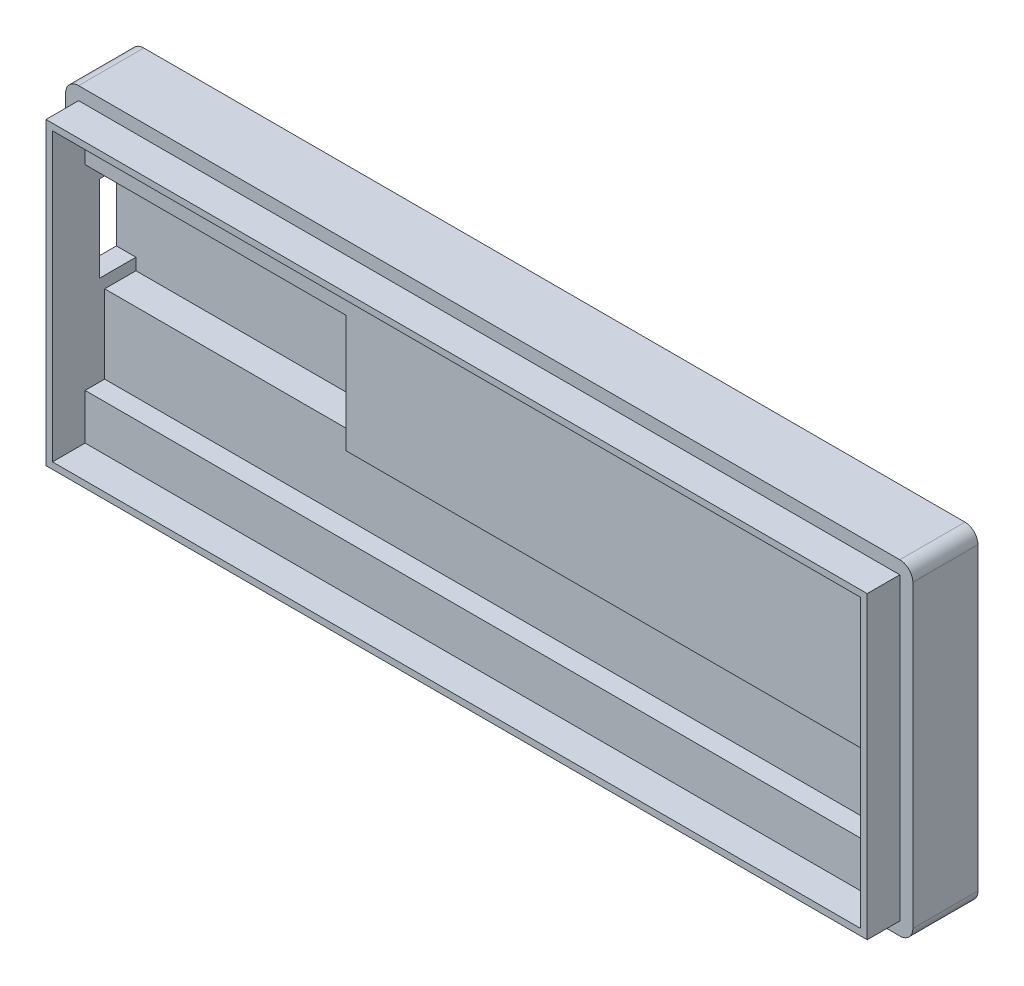
ISO-10303-21;
HEADER;
FILE_DESCRIPTION(('STEP AP214'),'2;1');
FILE_NAME('part.step','',(''),(''),'','','');
FILE_SCHEMA(('AUTOMOTIVE_DESIGN { 1 0 10303 214 1 1 1 1 }'));
ENDSEC;
DATA;
#1=APPLICATION_CONTEXT('core data for automotive mechanical design processes');
#2=APPLICATION_PROTOCOL_DEFINITION('international standard','automotive_design',2000,#1);
#3=PRODUCT_CONTEXT('',#1,'mechanical');
#4=PRODUCT('Part','Part','',(#3));
#5=PRODUCT_RELATED_PRODUCT_CATEGORY('part','',(#4));
#6=PRODUCT_DEFINITION_FORMATION('','',#4);
#7=PRODUCT_DEFINITION_CONTEXT('part definition',#1,'design');
#8=PRODUCT_DEFINITION('design','',#6,#7);
#9=PRODUCT_DEFINITION_SHAPE('','',#8);
#10=(LENGTH_UNIT() NAMED_UNIT(*) SI_UNIT(.MILLI.,.METRE.));
#11=(NAMED_UNIT(*) PLANE_ANGLE_UNIT() SI_UNIT($,.RADIAN.));
#12=(NAMED_UNIT(*) SI_UNIT($,.STERADIAN.) SOLID_ANGLE_UNIT());
#13=UNCERTAINTY_MEASURE_WITH_UNIT(LENGTH_MEASURE(1.E-05),#10,'distance_accuracy_value','');
#14=(GEOMETRIC_REPRESENTATION_CONTEXT(3) GLOBAL_UNCERTAINTY_ASSIGNED_CONTEXT((#13)) GLOBAL_UNIT_ASSIGNED_CONTEXT((#10,
#11,#12)) REPRESENTATION_CONTEXT('',''));
#15=CARTESIAN_POINT('',(0.,0.,0.));
#16=DIRECTION('',(0.,0.,1.));
#17=DIRECTION('',(1.,0.,0.));
#18=AXIS2_PLACEMENT_3D('',#15,#16,#17);
#19=CARTESIAN_POINT('',(0.,0.,0.));
#20=DIRECTION('',(0.,0.,1.));
#21=DIRECTION('',(1.,0.,0.));
#22=AXIS2_PLACEMENT_3D('',#19,#20,#21);
#23=PLANE('',#22);
#24=DIRECTION('',(-1.,0.,0.));
#25=VECTOR('',#24,1.);
#26=CARTESIAN_POINT('',(-62.5,21.9999999999999,0.));
#27=LINE('',#26,#25);
#28=CARTESIAN_POINT('',(61.5,21.9999999999999,0.));
#29=VERTEX_POINT('',#28);
#30=CARTESIAN_POINT('',(-62.5,21.9999999999999,0.));
#31=VERTEX_POINT('',#30);
#32=EDGE_CURVE('E236',#29,#31,#27,.T.);
#33=ORIENTED_EDGE('',*,*,#32,.T.);
#34=DIRECTION('',(0.,-1.,0.));
#35=VECTOR('',#34,1.);
#36=CARTESIAN_POINT('',(-62.5,21.9999999999999,0.));
#37=LINE('',#36,#35);
#38=CARTESIAN_POINT('',(-62.5,14.9999999999999,0.));
#39=VERTEX_POINT('',#38);
#40=EDGE_CURVE('E252',#31,#39,#37,.T.);
#41=ORIENTED_EDGE('',*,*,#40,.T.);
#42=DIRECTION('',(1.,0.,0.));
#43=VECTOR('',#42,1.);
#44=CARTESIAN_POINT('',(0.,14.9999999999999,0.));
#45=LINE('',#44,#43);
#46=CARTESIAN_POINT('',(-22.5,14.9999999999999,0.));
#47=VERTEX_POINT('',#46);
#48=EDGE_CURVE('E372',#39,#47,#45,.T.);
#49=ORIENTED_EDGE('',*,*,#48,.T.);
#50=DIRECTION('',(0.,1.,0.));
#51=VECTOR('',#50,1.);
#52=CARTESIAN_POINT('',(-22.5,0.,0.));
#53=LINE('',#52,#51);
#54=CARTESIAN_POINT('',(-22.5,-3.00000000000007,0.));
#55=VERTEX_POINT('',#54);
#56=EDGE_CURVE('E348',#55,#47,#53,.T.);
#57=ORIENTED_EDGE('',*,*,#56,.F.);
#58=DIRECTION('',(1.,0.,0.));
#59=VECTOR('',#58,1.);
#60=CARTESIAN_POINT('',(0.,-3.00000000000007,0.));
#61=LINE('',#60,#59);
#62=CARTESIAN_POINT('',(59.5,-3.00000000000007,0.));
#63=VERTEX_POINT('',#62);
#64=EDGE_CURVE('E363',#55,#63,#61,.T.);
#65=ORIENTED_EDGE('',*,*,#64,.T.);
#66=DIRECTION('',(0.,-1.,0.));
#67=VECTOR('',#66,1.);
#68=CARTESIAN_POINT('',(59.5,0.,0.));
#69=LINE('',#68,#67);
#70=CARTESIAN_POINT('',(59.5,-15.0000000000001,0.));
#71=VERTEX_POINT('',#70);
#72=EDGE_CURVE('E366',#63,#71,#69,.T.);
#73=ORIENTED_EDGE('',*,*,#72,.T.);
#74=DIRECTION('',(1.,0.,0.));
#75=VECTOR('',#74,1.);
#76=CARTESIAN_POINT('',(0.,-15.0000000000001,0.));
#77=LINE('',#76,#75);
#78=CARTESIAN_POINT('',(-62.5,-15.0000000000001,0.));
#79=VERTEX_POINT('',#78);
#80=EDGE_CURVE('E369',#79,#71,#77,.T.);
#81=ORIENTED_EDGE('',*,*,#80,.F.);
#82=CARTESIAN_POINT('',(-62.5,-22.0000000000001,0.));
#83=VERTEX_POINT('',#82);
#84=EDGE_CURVE('E254',#79,#83,#37,.T.);
#85=ORIENTED_EDGE('',*,*,#84,.T.);
#86=DIRECTION('',(1.,0.,0.));
#87=VECTOR('',#86,1.);
#88=CARTESIAN_POINT('',(-62.5,-22.0000000000001,0.));
#89=LINE('',#88,#87);
#90=CARTESIAN_POINT('',(61.5,-22.0000000000001,0.));
#91=VERTEX_POINT('',#90);
#92=EDGE_CURVE('E230',#83,#91,#89,.T.);
#93=ORIENTED_EDGE('',*,*,#92,.T.);
#94=DIRECTION('',(0.,1.,0.));
#95=VECTOR('',#94,1.);
#96=CARTESIAN_POINT('',(61.5,21.9999999999999,0.));
#97=LINE('',#96,#95);
#98=EDGE_CURVE('E249',#91,#29,#97,.T.);
#99=ORIENTED_EDGE('',*,*,#98,.T.);
#100=EDGE_LOOP('',(#33,#41,#49,#57,#65,#73,#81,#85,#93,#99));
#101=FACE_BOUND('',#100,.T.);
#102=ADVANCED_FACE('F34',(#101),#23,.T.);
#103=CARTESIAN_POINT('',(-22.5,0.,-10.));
#104=DIRECTION('',(1.,0.,0.));
#105=DIRECTION('',(0.,0.,-1.));
#106=AXIS2_PLACEMENT_3D('',#103,#104,#105);
#107=PLANE('',#106);
#108=DIRECTION('',(0.,1.,0.));
#109=VECTOR('',#108,1.);
#110=CARTESIAN_POINT('',(-22.5,0.,-7.8));
#111=LINE('',#110,#109);
#112=CARTESIAN_POINT('',(-22.5,-3.00000000000007,-7.8));
#113=VERTEX_POINT('',#112);
#114=CARTESIAN_POINT('',(-22.5,14.9999999999999,-7.8));
#115=VERTEX_POINT('',#114);
#116=EDGE_CURVE('E329',#113,#115,#111,.T.);
#117=ORIENTED_EDGE('',*,*,#116,.F.);
#118=DIRECTION('',(0.,0.,1.));
#119=VECTOR('',#118,1.);
#120=CARTESIAN_POINT('',(-22.5,-3.00000000000007,-10.));
#121=LINE('',#120,#119);
#122=CARTESIAN_POINT('',(-22.5,-3.00000000000007,-3.));
#123=VERTEX_POINT('',#122);
#124=EDGE_CURVE('E398',#113,#123,#121,.T.);
#125=ORIENTED_EDGE('',*,*,#124,.T.);
#126=EDGE_CURVE('E360',#123,#55,#121,.T.);
#127=ORIENTED_EDGE('',*,*,#126,.T.);
#128=ORIENTED_EDGE('',*,*,#56,.T.);
#129=DIRECTION('',(0.,0.,1.));
#130=VECTOR('',#129,1.);
#131=CARTESIAN_POINT('',(-22.5,14.9999999999999,-10.));
#132=LINE('',#131,#130);
#133=EDGE_CURVE('E386',#115,#47,#132,.T.);
#134=ORIENTED_EDGE('',*,*,#133,.F.);
#135=EDGE_LOOP('',(#117,#125,#127,#128,#134));
#136=FACE_BOUND('',#135,.T.);
#137=ADVANCED_FACE('F468',(#136),#107,.F.);
#138=CARTESIAN_POINT('',(0.,14.9999999999999,-10.));
#139=DIRECTION('',(0.,-1.,0.));
#140=DIRECTION('',(0.,0.,-1.));
#141=AXIS2_PLACEMENT_3D('',#138,#139,#140);
#142=PLANE('',#141);
#143=DIRECTION('',(0.,0.,1.));
#144=VECTOR('',#143,1.);
#145=CARTESIAN_POINT('',(-62.5,14.9999999999999,-10.));
#146=LINE('',#145,#144);
#147=CARTESIAN_POINT('',(-62.5,14.9999999999999,-7.8));
#148=VERTEX_POINT('',#147);
#149=EDGE_CURVE('E388',#148,#39,#146,.T.);
#150=ORIENTED_EDGE('',*,*,#149,.F.);
#151=DIRECTION('',(1.,0.,0.));
#152=VECTOR('',#151,1.);
#153=CARTESIAN_POINT('',(0.,14.9999999999999,-7.8));
#154=LINE('',#153,#152);
#155=EDGE_CURVE('E326',#148,#115,#154,.T.);
#156=ORIENTED_EDGE('',*,*,#155,.T.);
#157=ORIENTED_EDGE('',*,*,#133,.T.);
#158=ORIENTED_EDGE('',*,*,#48,.F.);
#159=EDGE_LOOP('',(#150,#156,#157,#158));
#160=FACE_BOUND('',#159,.T.);
#161=ADVANCED_FACE('F474',(#160),#142,.T.);
#162=CARTESIAN_POINT('',(-62.5,0.,-10.));
#163=DIRECTION('',(-1.,0.,0.));
#164=DIRECTION('',(0.,-1.,0.));
#165=AXIS2_PLACEMENT_3D('',#162,#163,#164);
#166=PLANE('',#165);
#167=DIRECTION('',(0.,1.,0.));
#168=VECTOR('',#167,1.);
#169=CARTESIAN_POINT('',(-62.5,0.,-2.2));
#170=LINE('',#169,#168);
#171=CARTESIAN_POINT('',(-62.5,-1.20000000000006,-2.2));
#172=VERTEX_POINT('',#171);
#173=CARTESIAN_POINT('',(-62.5,11.9999999999999,-2.2));
#174=VERTEX_POINT('',#173);
#175=EDGE_CURVE('E319',#172,#174,#170,.T.);
#176=ORIENTED_EDGE('',*,*,#175,.T.);
#177=DIRECTION('',(0.,0.,-1.));
#178=VECTOR('',#177,1.);
#179=CARTESIAN_POINT('',(-62.5,11.9999999999999,-10.));
#180=LINE('',#179,#178);
#181=CARTESIAN_POINT('',(-62.5,11.9999999999999,-7.8));
#182=VERTEX_POINT('',#181);
#183=EDGE_CURVE('E316',#174,#182,#180,.T.);
#184=ORIENTED_EDGE('',*,*,#183,.T.);
#185=DIRECTION('',(0.,1.,0.));
#186=VECTOR('',#185,1.);
#187=CARTESIAN_POINT('',(-62.5,0.,-7.8));
#188=LINE('',#187,#186);
#189=EDGE_CURVE('E322',#182,#148,#188,.T.);
#190=ORIENTED_EDGE('',*,*,#189,.T.);
#191=ORIENTED_EDGE('',*,*,#149,.T.);
#192=ORIENTED_EDGE('',*,*,#40,.F.);
#193=DIRECTION('',(0.,0.,-1.));
#194=VECTOR('',#193,1.);
#195=CARTESIAN_POINT('',(-62.5,21.9999999999999,5.));
#196=LINE('',#195,#194);
#197=CARTESIAN_POINT('',(-62.5,21.9999999999999,5.));
#198=VERTEX_POINT('',#197);
#199=EDGE_CURVE('E238',#198,#31,#196,.T.);
#200=ORIENTED_EDGE('',*,*,#199,.F.);
#201=DIRECTION('',(0.,-1.,0.));
#202=VECTOR('',#201,1.);
#203=CARTESIAN_POINT('',(-62.5,21.9999999999999,5.));
#204=LINE('',#203,#202);
#205=CARTESIAN_POINT('',(-62.5,-22.0000000000001,5.));
#206=VERTEX_POINT('',#205);
#207=EDGE_CURVE('E243',#198,#206,#204,.T.);
#208=ORIENTED_EDGE('',*,*,#207,.T.);
#209=DIRECTION('',(0.,0.,-1.));
#210=VECTOR('',#209,1.);
#211=CARTESIAN_POINT('',(-62.5,-22.0000000000001,5.));
#212=LINE('',#211,#210);
#213=EDGE_CURVE('E258',#206,#83,#212,.T.);
#214=ORIENTED_EDGE('',*,*,#213,.T.);
#215=ORIENTED_EDGE('',*,*,#84,.F.);
#216=DIRECTION('',(0.,0.,1.));
#217=VECTOR('',#216,1.);
#218=CARTESIAN_POINT('',(-62.5,-15.0000000000001,-10.));
#219=LINE('',#218,#217);
#220=CARTESIAN_POINT('',(-62.5,-15.0000000000001,-3.));
#221=VERTEX_POINT('',#220);
#222=EDGE_CURVE('E391',#221,#79,#219,.T.);
#223=ORIENTED_EDGE('',*,*,#222,.F.);
#224=DIRECTION('',(0.,-1.,0.));
#225=VECTOR('',#224,1.);
#226=CARTESIAN_POINT('',(-62.5,0.,-3.));
#227=LINE('',#226,#225);
#228=CARTESIAN_POINT('',(-62.5,-3.00000000000007,-3.));
#229=VERTEX_POINT('',#228);
#230=EDGE_CURVE('E333',#229,#221,#227,.T.);
#231=ORIENTED_EDGE('',*,*,#230,.F.);
#232=DIRECTION('',(0.,0.,-1.));
#233=VECTOR('',#232,1.);
#234=CARTESIAN_POINT('',(-62.5,-3.00000000000007,-3.));
#235=LINE('',#234,#233);
#236=CARTESIAN_POINT('',(-62.5,-3.00000000000007,-7.8));
#237=VERTEX_POINT('',#236);
#238=EDGE_CURVE('E345',#229,#237,#235,.T.);
#239=ORIENTED_EDGE('',*,*,#238,.T.);
#240=CARTESIAN_POINT('',(-62.5,-1.20000000000006,-7.8));
#241=VERTEX_POINT('',#240);
#242=EDGE_CURVE('E323',#237,#241,#188,.T.);
#243=ORIENTED_EDGE('',*,*,#242,.T.);
#244=DIRECTION('',(0.,0.,1.));
#245=VECTOR('',#244,1.);
#246=CARTESIAN_POINT('',(-62.5,-1.20000000000006,-10.));
#247=LINE('',#246,#245);
#248=EDGE_CURVE('E307',#241,#172,#247,.T.);
#249=ORIENTED_EDGE('',*,*,#248,.T.);
#250=EDGE_LOOP('',(#176,#184,#190,#191,#192,#200,#208,#214,#215,#223,#231,#239,#243,#249));
#251=FACE_BOUND('',#250,.T.);
#252=ADVANCED_FACE('F533',(#251),#166,.F.);
#253=CARTESIAN_POINT('',(0.,-3.00000000000007,-3.));
#254=DIRECTION('',(0.,1.,0.));
#255=DIRECTION('',(0.,0.,1.));
#256=AXIS2_PLACEMENT_3D('',#253,#254,#255);
#257=PLANE('',#256);
#258=ORIENTED_EDGE('',*,*,#124,.F.);
#259=DIRECTION('',(1.,0.,0.));
#260=VECTOR('',#259,1.);
#261=CARTESIAN_POINT('',(0.,-3.00000000000007,-7.8));
#262=LINE('',#261,#260);
#263=EDGE_CURVE('E331',#237,#113,#262,.T.);
#264=ORIENTED_EDGE('',*,*,#263,.F.);
#265=ORIENTED_EDGE('',*,*,#238,.F.);
#266=DIRECTION('',(1.,0.,0.));
#267=VECTOR('',#266,1.);
#268=CARTESIAN_POINT('',(0.,-3.00000000000007,-3.));
#269=LINE('',#268,#267);
#270=EDGE_CURVE('E342',#229,#123,#269,.T.);
#271=ORIENTED_EDGE('',*,*,#270,.T.);
#272=EDGE_LOOP('',(#258,#264,#265,#271));
#273=FACE_BOUND('',#272,.T.);
#274=ADVANCED_FACE('F531',(#273),#257,.T.);
#275=CARTESIAN_POINT('',(0.,-25.0000000000001,-10.));
#276=DIRECTION('',(0.,-1.,0.));
#277=DIRECTION('',(1.,0.,0.));
#278=AXIS2_PLACEMENT_3D('',#275,#276,#277);
#279=PLANE('',#278);
#280=DIRECTION('',(1.,0.,0.));
#281=VECTOR('',#280,1.);
#282=CARTESIAN_POINT('',(0.,-25.0000000000001,-10.));
#283=LINE('',#282,#281);
#284=CARTESIAN_POINT('',(-63.5,-25.0000000000001,-10.));
#285=VERTEX_POINT('',#284);
#286=CARTESIAN_POINT('',(62.5,-25.,-10.));
#287=VERTEX_POINT('',#286);
#288=EDGE_CURVE('E349',#285,#287,#283,.T.);
#289=ORIENTED_EDGE('',*,*,#288,.T.);
#290=DIRECTION('',(0.,0.,1.));
#291=VECTOR('',#290,1.);
#292=CARTESIAN_POINT('',(62.5,-25.,-10.));
#293=LINE('',#292,#291);
#294=CARTESIAN_POINT('',(62.5,-25.,0.));
#295=VERTEX_POINT('',#294);
#296=EDGE_CURVE('E11',#287,#295,#293,.T.);
#297=ORIENTED_EDGE('',*,*,#296,.T.);
#298=DIRECTION('',(1.,0.,0.));
#299=VECTOR('',#298,1.);
#300=CARTESIAN_POINT('',(0.,-25.0000000000001,0.));
#301=LINE('',#300,#299);
#302=CARTESIAN_POINT('',(-63.5,-25.0000000000001,0.));
#303=VERTEX_POINT('',#302);
#304=EDGE_CURVE('E375',#303,#295,#301,.T.);
#305=ORIENTED_EDGE('',*,*,#304,.F.);
#306=DIRECTION('',(0.,0.,1.));
#307=VECTOR('',#306,1.);
#308=CARTESIAN_POINT('',(-63.5,-25.0000000000001,-10.));
#309=LINE('',#308,#307);
#310=EDGE_CURVE('E42',#303,#285,#309,.F.);
#311=ORIENTED_EDGE('',*,*,#310,.T.);
#312=EDGE_LOOP('',(#289,#297,#305,#311));
#313=FACE_BOUND('',#312,.T.);
#314=ADVANCED_FACE('F432',(#313),#279,.T.);
#315=CARTESIAN_POINT('',(-65.5,0.,-10.));
#316=DIRECTION('',(1.,0.,0.));
#317=DIRECTION('',(0.,1.,0.));
#318=AXIS2_PLACEMENT_3D('',#315,#316,#317);
#319=PLANE('',#318);
#320=DIRECTION('',(0.,0.,1.));
#321=VECTOR('',#320,1.);
#322=CARTESIAN_POINT('',(-65.5,-1.20000000000006,-7.8));
#323=LINE('',#322,#321);
#324=CARTESIAN_POINT('',(-65.5,-1.20000000000006,-7.8));
#325=VERTEX_POINT('',#324);
#326=CARTESIAN_POINT('',(-65.5,-1.20000000000006,-2.2));
#327=VERTEX_POINT('',#326);
#328=EDGE_CURVE('E295',#325,#327,#323,.T.);
#329=ORIENTED_EDGE('',*,*,#328,.F.);
#330=DIRECTION('',(0.,-1.,0.));
#331=VECTOR('',#330,1.);
#332=CARTESIAN_POINT('',(-65.5,11.9999999999999,-7.8));
#333=LINE('',#332,#331);
#334=CARTESIAN_POINT('',(-65.5,11.9999999999999,-7.8));
#335=VERTEX_POINT('',#334);
#336=EDGE_CURVE('E293',#335,#325,#333,.T.);
#337=ORIENTED_EDGE('',*,*,#336,.F.);
#338=DIRECTION('',(0.,0.,-1.));
#339=VECTOR('',#338,1.);
#340=CARTESIAN_POINT('',(-65.5,11.9999999999999,-7.8));
#341=LINE('',#340,#339);
#342=CARTESIAN_POINT('',(-65.5,11.9999999999999,-2.2));
#343=VERTEX_POINT('',#342);
#344=EDGE_CURVE('E301',#343,#335,#341,.T.);
#345=ORIENTED_EDGE('',*,*,#344,.F.);
#346=DIRECTION('',(0.,1.,0.));
#347=VECTOR('',#346,1.);
#348=CARTESIAN_POINT('',(-65.5,11.9999999999999,-2.2));
#349=LINE('',#348,#347);
#350=EDGE_CURVE('E298',#327,#343,#349,.T.);
#351=ORIENTED_EDGE('',*,*,#350,.F.);
#352=EDGE_LOOP('',(#329,#337,#345,#351));
#353=FACE_BOUND('',#352,.T.);
#354=DIRECTION('',(0.,1.,0.));
#355=VECTOR('',#354,1.);
#356=CARTESIAN_POINT('',(-65.5,0.,0.));
#357=LINE('',#356,#355);
#358=CARTESIAN_POINT('',(-65.5,-23.0000000000001,0.));
#359=VERTEX_POINT('',#358);
#360=CARTESIAN_POINT('',(-65.5,22.9999999999999,0.));
#361=VERTEX_POINT('',#360);
#362=EDGE_CURVE('E353',#359,#361,#357,.T.);
#363=ORIENTED_EDGE('',*,*,#362,.T.);
#364=DIRECTION('',(0.,0.,1.));
#365=VECTOR('',#364,1.);
#366=CARTESIAN_POINT('',(-65.5,22.9999999999999,-10.));
#367=LINE('',#366,#365);
#368=CARTESIAN_POINT('',(-65.5,22.9999999999999,-10.));
#369=VERTEX_POINT('',#368);
#370=EDGE_CURVE('E416',#361,#369,#367,.F.);
#371=ORIENTED_EDGE('',*,*,#370,.T.);
#372=DIRECTION('',(0.,1.,0.));
#373=VECTOR('',#372,1.);
#374=CARTESIAN_POINT('',(-65.5,0.,-10.));
#375=LINE('',#374,#373);
#376=CARTESIAN_POINT('',(-65.5,-23.0000000000001,-10.));
#377=VERTEX_POINT('',#376);
#378=EDGE_CURVE('E357',#377,#369,#375,.T.);
#379=ORIENTED_EDGE('',*,*,#378,.F.);
#380=DIRECTION('',(0.,0.,1.));
#381=VECTOR('',#380,1.);
#382=CARTESIAN_POINT('',(-65.5,-23.0000000000001,0.));
#383=LINE('',#382,#381);
#384=EDGE_CURVE('E413',#377,#359,#383,.T.);
#385=ORIENTED_EDGE('',*,*,#384,.T.);
#386=EDGE_LOOP('',(#363,#371,#379,#385));
#387=FACE_BOUND('',#386,.T.);
#388=ADVANCED_FACE('F442',(#353,#387),#319,.F.);
#389=CARTESIAN_POINT('',(0.,25.,-10.));
#390=DIRECTION('',(0.,-1.,0.));
#391=DIRECTION('',(1.,0.,0.));
#392=AXIS2_PLACEMENT_3D('',#389,#390,#391);
#393=PLANE('',#392);
#394=DIRECTION('',(1.,0.,0.));
#395=VECTOR('',#394,1.);
#396=CARTESIAN_POINT('',(0.,25.,-10.));
#397=LINE('',#396,#395);
#398=CARTESIAN_POINT('',(-63.5,24.9999999999999,-10.));
#399=VERTEX_POINT('',#398);
#400=CARTESIAN_POINT('',(62.5,25.,-10.));
#401=VERTEX_POINT('',#400);
#402=EDGE_CURVE('E355',#399,#401,#397,.T.);
#403=ORIENTED_EDGE('',*,*,#402,.F.);
#404=DIRECTION('',(0.,0.,1.));
#405=VECTOR('',#404,1.);
#406=CARTESIAN_POINT('',(-63.5,24.9999999999999,-10.));
#407=LINE('',#406,#405);
#408=CARTESIAN_POINT('',(-63.5,24.9999999999999,0.));
#409=VERTEX_POINT('',#408);
#410=EDGE_CURVE('E402',#399,#409,#407,.T.);
#411=ORIENTED_EDGE('',*,*,#410,.T.);
#412=DIRECTION('',(1.,0.,0.));
#413=VECTOR('',#412,1.);
#414=CARTESIAN_POINT('',(0.,25.,0.));
#415=LINE('',#414,#413);
#416=CARTESIAN_POINT('',(62.5,25.,0.));
#417=VERTEX_POINT('',#416);
#418=EDGE_CURVE('E381',#409,#417,#415,.T.);
#419=ORIENTED_EDGE('',*,*,#418,.T.);
#420=DIRECTION('',(0.,0.,1.));
#421=VECTOR('',#420,1.);
#422=CARTESIAN_POINT('',(62.5,25.,-10.));
#423=LINE('',#422,#421);
#424=EDGE_CURVE('E400',#417,#401,#423,.F.);
#425=ORIENTED_EDGE('',*,*,#424,.T.);
#426=EDGE_LOOP('',(#403,#411,#419,#425));
#427=FACE_BOUND('',#426,.T.);
#428=ADVANCED_FACE('F453',(#427),#393,.F.);
#429=CARTESIAN_POINT('',(0.,-15.0000000000001,-10.));
#430=DIRECTION('',(0.,-1.,0.));
#431=DIRECTION('',(0.,0.,-1.));
#432=AXIS2_PLACEMENT_3D('',#429,#430,#431);
#433=PLANE('',#432);
#434=DIRECTION('',(0.,0.,1.));
#435=VECTOR('',#434,1.);
#436=CARTESIAN_POINT('',(59.5,-15.0000000000001,-10.));
#437=LINE('',#436,#435);
#438=CARTESIAN_POINT('',(59.5,-15.0000000000001,-3.));
#439=VERTEX_POINT('',#438);
#440=EDGE_CURVE('E394',#439,#71,#437,.T.);
#441=ORIENTED_EDGE('',*,*,#440,.F.);
#442=DIRECTION('',(1.,0.,0.));
#443=VECTOR('',#442,1.);
#444=CARTESIAN_POINT('',(0.,-15.0000000000001,-3.));
#445=LINE('',#444,#443);
#446=EDGE_CURVE('E336',#221,#439,#445,.T.);
#447=ORIENTED_EDGE('',*,*,#446,.F.);
#448=ORIENTED_EDGE('',*,*,#222,.T.);
#449=ORIENTED_EDGE('',*,*,#80,.T.);
#450=EDGE_LOOP('',(#441,#447,#448,#449));
#451=FACE_BOUND('',#450,.T.);
#452=ADVANCED_FACE('F562',(#451),#433,.F.);
#453=CARTESIAN_POINT('',(59.5,0.,-10.));
#454=DIRECTION('',(-1.,0.,0.));
#455=DIRECTION('',(0.,-1.,0.));
#456=AXIS2_PLACEMENT_3D('',#453,#454,#455);
#457=PLANE('',#456);
#458=DIRECTION('',(0.,-1.,0.));
#459=VECTOR('',#458,1.);
#460=CARTESIAN_POINT('',(59.5,0.,-3.));
#461=LINE('',#460,#459);
#462=CARTESIAN_POINT('',(59.5,-3.00000000000007,-3.));
#463=VERTEX_POINT('',#462);
#464=EDGE_CURVE('E339',#463,#439,#461,.T.);
#465=ORIENTED_EDGE('',*,*,#464,.T.);
#466=ORIENTED_EDGE('',*,*,#440,.T.);
#467=ORIENTED_EDGE('',*,*,#72,.F.);
#468=DIRECTION('',(0.,0.,1.));
#469=VECTOR('',#468,1.);
#470=CARTESIAN_POINT('',(59.5,-3.00000000000007,-10.));
#471=LINE('',#470,#469);
#472=EDGE_CURVE('E396',#463,#63,#471,.T.);
#473=ORIENTED_EDGE('',*,*,#472,.F.);
#474=EDGE_LOOP('',(#465,#466,#467,#473));
#475=FACE_BOUND('',#474,.T.);
#476=ADVANCED_FACE('F559',(#475),#457,.T.);
#477=CARTESIAN_POINT('',(0.,-3.00000000000007,-10.));
#478=DIRECTION('',(0.,-1.,0.));
#479=DIRECTION('',(0.,0.,-1.));
#480=AXIS2_PLACEMENT_3D('',#477,#478,#479);
#481=PLANE('',#480);
#482=EDGE_CURVE('E341',#123,#463,#269,.T.);
#483=ORIENTED_EDGE('',*,*,#482,.T.);
#484=ORIENTED_EDGE('',*,*,#472,.T.);
#485=ORIENTED_EDGE('',*,*,#64,.F.);
#486=ORIENTED_EDGE('',*,*,#126,.F.);
#487=EDGE_LOOP('',(#483,#484,#485,#486));
#488=FACE_BOUND('',#487,.T.);
#489=ADVANCED_FACE('F554',(#488),#481,.T.);
#490=CARTESIAN_POINT('',(64.5,0.,-10.));
#491=DIRECTION('',(1.,0.,0.));
#492=DIRECTION('',(0.,1.,0.));
#493=AXIS2_PLACEMENT_3D('',#490,#491,#492);
#494=PLANE('',#493);
#495=DIRECTION('',(0.,1.,0.));
#496=VECTOR('',#495,1.);
#497=CARTESIAN_POINT('',(64.5,0.,-10.));
#498=LINE('',#497,#496);
#499=CARTESIAN_POINT('',(64.5,-23.,-10.));
#500=VERTEX_POINT('',#499);
#501=CARTESIAN_POINT('',(64.5,23.,-10.));
#502=VERTEX_POINT('',#501);
#503=EDGE_CURVE('E352',#500,#502,#498,.T.);
#504=ORIENTED_EDGE('',*,*,#503,.T.);
#505=DIRECTION('',(0.,0.,1.));
#506=VECTOR('',#505,1.);
#507=CARTESIAN_POINT('',(64.5,23.,0.));
#508=LINE('',#507,#506);
#509=CARTESIAN_POINT('',(64.5,23.,0.));
#510=VERTEX_POINT('',#509);
#511=EDGE_CURVE('E426',#502,#510,#508,.T.);
#512=ORIENTED_EDGE('',*,*,#511,.T.);
#513=DIRECTION('',(0.,1.,0.));
#514=VECTOR('',#513,1.);
#515=CARTESIAN_POINT('',(64.5,0.,0.));
#516=LINE('',#515,#514);
#517=CARTESIAN_POINT('',(64.5,-23.,0.));
#518=VERTEX_POINT('',#517);
#519=EDGE_CURVE('E378',#518,#510,#516,.T.);
#520=ORIENTED_EDGE('',*,*,#519,.F.);
#521=DIRECTION('',(0.,0.,1.));
#522=VECTOR('',#521,1.);
#523=CARTESIAN_POINT('',(64.5,-23.,-10.));
#524=LINE('',#523,#522);
#525=EDGE_CURVE('E56',#518,#500,#524,.F.);
#526=ORIENTED_EDGE('',*,*,#525,.T.);
#527=EDGE_LOOP('',(#504,#512,#520,#526));
#528=FACE_BOUND('',#527,.T.);
#529=ADVANCED_FACE('F458',(#528),#494,.T.);
#530=CARTESIAN_POINT('',(0.,0.,-10.));
#531=DIRECTION('',(0.,0.,1.));
#532=DIRECTION('',(1.,0.,0.));
#533=AXIS2_PLACEMENT_3D('',#530,#531,#532);
#534=PLANE('',#533);
#535=ORIENTED_EDGE('',*,*,#378,.T.);
#536=CARTESIAN_POINT('',(-63.5,22.9999999999999,-10.));
#537=DIRECTION('',(0.,0.,1.));
#538=DIRECTION('',(1.,0.,0.));
#539=AXIS2_PLACEMENT_3D('',#536,#537,#538);
#540=CIRCLE('',#539,2.);
#541=EDGE_CURVE('E423',#369,#399,#540,.F.);
#542=ORIENTED_EDGE('',*,*,#541,.T.);
#543=ORIENTED_EDGE('',*,*,#402,.T.);
#544=CARTESIAN_POINT('',(62.5,23.,-10.));
#545=DIRECTION('',(0.,0.,1.));
#546=DIRECTION('',(1.,0.,0.));
#547=AXIS2_PLACEMENT_3D('',#544,#545,#546);
#548=CIRCLE('',#547,2.);
#549=EDGE_CURVE('E49',#401,#502,#548,.F.);
#550=ORIENTED_EDGE('',*,*,#549,.T.);
#551=ORIENTED_EDGE('',*,*,#503,.F.);
#552=CARTESIAN_POINT('',(62.5,-23.,-10.));
#553=DIRECTION('',(0.,0.,1.));
#554=DIRECTION('',(1.,0.,0.));
#555=AXIS2_PLACEMENT_3D('',#552,#553,#554);
#556=CIRCLE('',#555,2.);
#557=EDGE_CURVE('E420',#500,#287,#556,.F.);
#558=ORIENTED_EDGE('',*,*,#557,.T.);
#559=ORIENTED_EDGE('',*,*,#288,.F.);
#560=CARTESIAN_POINT('',(-63.5,-23.0000000000001,-10.));
#561=DIRECTION('',(0.,0.,1.));
#562=DIRECTION('',(1.,0.,0.));
#563=AXIS2_PLACEMENT_3D('',#560,#561,#562);
#564=CIRCLE('',#563,2.);
#565=EDGE_CURVE('E418',#285,#377,#564,.F.);
#566=ORIENTED_EDGE('',*,*,#565,.T.);
#567=EDGE_LOOP('',(#535,#542,#543,#550,#551,#558,#559,#566));
#568=FACE_BOUND('',#567,.T.);
#569=ADVANCED_FACE('F436',(#568),#534,.F.);
#570=DIRECTION('',(0.,1.,0.));
#571=VECTOR('',#570,1.);
#572=CARTESIAN_POINT('',(62.5,22.9999999999999,0.));
#573=LINE('',#572,#571);
#574=CARTESIAN_POINT('',(62.5,-23.0000000000001,0.));
#575=VERTEX_POINT('',#574);
#576=CARTESIAN_POINT('',(62.5,22.9999999999999,0.));
#577=VERTEX_POINT('',#576);
#578=EDGE_CURVE('E237',#575,#577,#573,.T.);
#579=ORIENTED_EDGE('',*,*,#578,.F.);
#580=DIRECTION('',(1.,0.,0.));
#581=VECTOR('',#580,1.);
#582=CARTESIAN_POINT('',(-63.5,-23.0000000000001,0.));
#583=LINE('',#582,#581);
#584=CARTESIAN_POINT('',(-63.5,-23.0000000000001,0.));
#585=VERTEX_POINT('',#584);
#586=EDGE_CURVE('E265',#585,#575,#583,.T.);
#587=ORIENTED_EDGE('',*,*,#586,.F.);
#588=DIRECTION('',(0.,-1.,0.));
#589=VECTOR('',#588,1.);
#590=CARTESIAN_POINT('',(-63.5,22.9999999999999,0.));
#591=LINE('',#590,#589);
#592=CARTESIAN_POINT('',(-63.5,22.9999999999999,0.));
#593=VERTEX_POINT('',#592);
#594=EDGE_CURVE('E277',#593,#585,#591,.T.);
#595=ORIENTED_EDGE('',*,*,#594,.F.);
#596=DIRECTION('',(-1.,0.,0.));
#597=VECTOR('',#596,1.);
#598=CARTESIAN_POINT('',(-63.5,22.9999999999999,0.));
#599=LINE('',#598,#597);
#600=EDGE_CURVE('E274',#577,#593,#599,.T.);
#601=ORIENTED_EDGE('',*,*,#600,.F.);
#602=EDGE_LOOP('',(#579,#587,#595,#601));
#603=FACE_BOUND('',#602,.T.);
#604=ORIENTED_EDGE('',*,*,#418,.F.);
#605=CARTESIAN_POINT('',(-63.5,22.9999999999999,0.));
#606=DIRECTION('',(0.,0.,1.));
#607=DIRECTION('',(1.,0.,0.));
#608=AXIS2_PLACEMENT_3D('',#605,#606,#607);
#609=CIRCLE('',#608,2.);
#610=EDGE_CURVE('E411',#409,#361,#609,.T.);
#611=ORIENTED_EDGE('',*,*,#610,.T.);
#612=ORIENTED_EDGE('',*,*,#362,.F.);
#613=CARTESIAN_POINT('',(-63.5,-23.0000000000001,0.));
#614=DIRECTION('',(0.,0.,1.));
#615=DIRECTION('',(1.,0.,0.));
#616=AXIS2_PLACEMENT_3D('',#613,#614,#615);
#617=CIRCLE('',#616,2.);
#618=EDGE_CURVE('E405',#359,#303,#617,.T.);
#619=ORIENTED_EDGE('',*,*,#618,.T.);
#620=ORIENTED_EDGE('',*,*,#304,.T.);
#621=CARTESIAN_POINT('',(62.5,-23.,0.));
#622=DIRECTION('',(0.,0.,1.));
#623=DIRECTION('',(1.,0.,0.));
#624=AXIS2_PLACEMENT_3D('',#621,#622,#623);
#625=CIRCLE('',#624,2.);
#626=EDGE_CURVE('E407',#295,#518,#625,.T.);
#627=ORIENTED_EDGE('',*,*,#626,.T.);
#628=ORIENTED_EDGE('',*,*,#519,.T.);
#629=CARTESIAN_POINT('',(62.5,23.,0.));
#630=DIRECTION('',(0.,0.,1.));
#631=DIRECTION('',(1.,0.,0.));
#632=AXIS2_PLACEMENT_3D('',#629,#630,#631);
#633=CIRCLE('',#632,2.);
#634=EDGE_CURVE('E409',#510,#417,#633,.T.);
#635=ORIENTED_EDGE('',*,*,#634,.T.);
#636=EDGE_LOOP('',(#604,#611,#612,#619,#620,#627,#628,#635));
#637=FACE_BOUND('',#636,.T.);
#638=ADVANCED_FACE('F446',(#603,#637),#23,.T.);
#639=CARTESIAN_POINT('',(0.,0.,-3.));
#640=DIRECTION('',(0.,0.,1.));
#641=DIRECTION('',(1.,0.,0.));
#642=AXIS2_PLACEMENT_3D('',#639,#640,#641);
#643=PLANE('',#642);
#644=ORIENTED_EDGE('',*,*,#230,.T.);
#645=ORIENTED_EDGE('',*,*,#446,.T.);
#646=ORIENTED_EDGE('',*,*,#464,.F.);
#647=ORIENTED_EDGE('',*,*,#482,.F.);
#648=ORIENTED_EDGE('',*,*,#270,.F.);
#649=EDGE_LOOP('',(#644,#645,#646,#647,#648));
#650=FACE_BOUND('',#649,.T.);
#651=ADVANCED_FACE('F480',(#650),#643,.T.);
#652=CARTESIAN_POINT('',(0.,0.,-7.8));
#653=DIRECTION('',(0.,0.,-1.));
#654=DIRECTION('',(-1.,0.,0.));
#655=AXIS2_PLACEMENT_3D('',#652,#653,#654);
#656=PLANE('',#655);
#657=ORIENTED_EDGE('',*,*,#189,.F.);
#658=DIRECTION('',(-1.,0.,0.));
#659=VECTOR('',#658,1.);
#660=CARTESIAN_POINT('',(-54.5,11.9999999999999,-7.8));
#661=LINE('',#660,#659);
#662=EDGE_CURVE('E305',#182,#335,#661,.T.);
#663=ORIENTED_EDGE('',*,*,#662,.T.);
#664=ORIENTED_EDGE('',*,*,#336,.T.);
#665=DIRECTION('',(-1.,0.,0.));
#666=VECTOR('',#665,1.);
#667=CARTESIAN_POINT('',(-54.5,-1.20000000000006,-7.8));
#668=LINE('',#667,#666);
#669=EDGE_CURVE('E304',#241,#325,#668,.T.);
#670=ORIENTED_EDGE('',*,*,#669,.F.);
#671=ORIENTED_EDGE('',*,*,#242,.F.);
#672=ORIENTED_EDGE('',*,*,#263,.T.);
#673=ORIENTED_EDGE('',*,*,#116,.T.);
#674=ORIENTED_EDGE('',*,*,#155,.F.);
#675=EDGE_LOOP('',(#657,#663,#664,#670,#671,#672,#673,#674));
#676=FACE_BOUND('',#675,.T.);
#677=ADVANCED_FACE('F487',(#676),#656,.F.);
#678=CARTESIAN_POINT('',(-54.5,11.9999999999999,-2.2));
#679=DIRECTION('',(0.,0.,1.));
#680=DIRECTION('',(0.,-1.,0.));
#681=AXIS2_PLACEMENT_3D('',#678,#679,#680);
#682=PLANE('',#681);
#683=DIRECTION('',(-1.,0.,0.));
#684=VECTOR('',#683,1.);
#685=CARTESIAN_POINT('',(-54.5,-1.20000000000006,-2.2));
#686=LINE('',#685,#684);
#687=EDGE_CURVE('E310',#172,#327,#686,.T.);
#688=ORIENTED_EDGE('',*,*,#687,.T.);
#689=ORIENTED_EDGE('',*,*,#350,.T.);
#690=DIRECTION('',(-1.,0.,0.));
#691=VECTOR('',#690,1.);
#692=CARTESIAN_POINT('',(-54.5,11.9999999999999,-2.2));
#693=LINE('',#692,#691);
#694=EDGE_CURVE('E308',#174,#343,#693,.T.);
#695=ORIENTED_EDGE('',*,*,#694,.F.);
#696=ORIENTED_EDGE('',*,*,#175,.F.);
#697=EDGE_LOOP('',(#688,#689,#695,#696));
#698=FACE_BOUND('',#697,.T.);
#699=ADVANCED_FACE('F520',(#698),#682,.F.);
#700=CARTESIAN_POINT('',(-54.5,11.9999999999999,-7.8));
#701=DIRECTION('',(0.,1.,0.));
#702=DIRECTION('',(0.,0.,1.));
#703=AXIS2_PLACEMENT_3D('',#700,#701,#702);
#704=PLANE('',#703);
#705=ORIENTED_EDGE('',*,*,#694,.T.);
#706=ORIENTED_EDGE('',*,*,#344,.T.);
#707=ORIENTED_EDGE('',*,*,#662,.F.);
#708=ORIENTED_EDGE('',*,*,#183,.F.);
#709=EDGE_LOOP('',(#705,#706,#707,#708));
#710=FACE_BOUND('',#709,.T.);
#711=ADVANCED_FACE('F516',(#710),#704,.F.);
#712=CARTESIAN_POINT('',(-54.5,-1.20000000000006,-7.8));
#713=DIRECTION('',(0.,-1.,0.));
#714=DIRECTION('',(1.,0.,0.));
#715=AXIS2_PLACEMENT_3D('',#712,#713,#714);
#716=PLANE('',#715);
#717=ORIENTED_EDGE('',*,*,#669,.T.);
#718=ORIENTED_EDGE('',*,*,#328,.T.);
#719=ORIENTED_EDGE('',*,*,#687,.F.);
#720=ORIENTED_EDGE('',*,*,#248,.F.);
#721=EDGE_LOOP('',(#717,#718,#719,#720));
#722=FACE_BOUND('',#721,.T.);
#723=ADVANCED_FACE('F519',(#722),#716,.F.);
#724=CARTESIAN_POINT('',(0.,0.,5.));
#725=DIRECTION('',(0.,0.,1.));
#726=DIRECTION('',(1.,0.,0.));
#727=AXIS2_PLACEMENT_3D('',#724,#725,#726);
#728=PLANE('',#727);
#729=DIRECTION('',(0.,1.,0.));
#730=VECTOR('',#729,1.);
#731=CARTESIAN_POINT('',(62.5,22.9999999999999,5.));
#732=LINE('',#731,#730);
#733=CARTESIAN_POINT('',(62.5,-23.0000000000001,5.));
#734=VERTEX_POINT('',#733);
#735=CARTESIAN_POINT('',(62.5,22.9999999999999,5.));
#736=VERTEX_POINT('',#735);
#737=EDGE_CURVE('E261',#734,#736,#732,.T.);
#738=ORIENTED_EDGE('',*,*,#737,.T.);
#739=DIRECTION('',(-1.,0.,0.));
#740=VECTOR('',#739,1.);
#741=CARTESIAN_POINT('',(-63.5,22.9999999999999,5.));
#742=LINE('',#741,#740);
#743=CARTESIAN_POINT('',(-63.5,22.9999999999999,5.));
#744=VERTEX_POINT('',#743);
#745=EDGE_CURVE('E264',#736,#744,#742,.T.);
#746=ORIENTED_EDGE('',*,*,#745,.T.);
#747=DIRECTION('',(0.,-1.,0.));
#748=VECTOR('',#747,1.);
#749=CARTESIAN_POINT('',(-63.5,22.9999999999999,5.));
#750=LINE('',#749,#748);
#751=CARTESIAN_POINT('',(-63.5,-23.0000000000001,5.));
#752=VERTEX_POINT('',#751);
#753=EDGE_CURVE('E267',#744,#752,#750,.T.);
#754=ORIENTED_EDGE('',*,*,#753,.T.);
#755=DIRECTION('',(1.,0.,0.));
#756=VECTOR('',#755,1.);
#757=CARTESIAN_POINT('',(-63.5,-23.0000000000001,5.));
#758=LINE('',#757,#756);
#759=EDGE_CURVE('E269',#752,#734,#758,.T.);
#760=ORIENTED_EDGE('',*,*,#759,.T.);
#761=EDGE_LOOP('',(#738,#746,#754,#760));
#762=FACE_BOUND('',#761,.T.);
#763=DIRECTION('',(-1.,0.,0.));
#764=VECTOR('',#763,1.);
#765=CARTESIAN_POINT('',(-62.5,21.9999999999999,5.));
#766=LINE('',#765,#764);
#767=CARTESIAN_POINT('',(61.5,21.9999999999999,5.));
#768=VERTEX_POINT('',#767);
#769=EDGE_CURVE('E229',#768,#198,#766,.T.);
#770=ORIENTED_EDGE('',*,*,#769,.F.);
#771=DIRECTION('',(0.,1.,0.));
#772=VECTOR('',#771,1.);
#773=CARTESIAN_POINT('',(61.5,21.9999999999999,5.));
#774=LINE('',#773,#772);
#775=CARTESIAN_POINT('',(61.5,-22.0000000000001,5.));
#776=VERTEX_POINT('',#775);
#777=EDGE_CURVE('E219',#776,#768,#774,.T.);
#778=ORIENTED_EDGE('',*,*,#777,.F.);
#779=DIRECTION('',(1.,0.,0.));
#780=VECTOR('',#779,1.);
#781=CARTESIAN_POINT('',(-62.5,-22.0000000000001,5.));
#782=LINE('',#781,#780);
#783=EDGE_CURVE('E245',#206,#776,#782,.T.);
#784=ORIENTED_EDGE('',*,*,#783,.F.);
#785=ORIENTED_EDGE('',*,*,#207,.F.);
#786=EDGE_LOOP('',(#770,#778,#784,#785));
#787=FACE_BOUND('',#786,.T.);
#788=ADVANCED_FACE('F241',(#762,#787),#728,.T.);
#789=CARTESIAN_POINT('',(62.5,22.9999999999999,5.));
#790=DIRECTION('',(-1.,0.,0.));
#791=DIRECTION('',(0.,0.,1.));
#792=AXIS2_PLACEMENT_3D('',#789,#790,#791);
#793=PLANE('',#792);
#794=ORIENTED_EDGE('',*,*,#578,.T.);
#795=DIRECTION('',(0.,0.,-1.));
#796=VECTOR('',#795,1.);
#797=CARTESIAN_POINT('',(62.5,22.9999999999999,5.));
#798=LINE('',#797,#796);
#799=EDGE_CURVE('E290',#736,#577,#798,.T.);
#800=ORIENTED_EDGE('',*,*,#799,.F.);
#801=ORIENTED_EDGE('',*,*,#737,.F.);
#802=DIRECTION('',(0.,0.,-1.));
#803=VECTOR('',#802,1.);
#804=CARTESIAN_POINT('',(62.5,-23.0000000000001,5.));
#805=LINE('',#804,#803);
#806=EDGE_CURVE('E271',#734,#575,#805,.T.);
#807=ORIENTED_EDGE('',*,*,#806,.T.);
#808=EDGE_LOOP('',(#794,#800,#801,#807));
#809=FACE_BOUND('',#808,.T.);
#810=ADVANCED_FACE('F498',(#809),#793,.F.);
#811=CARTESIAN_POINT('',(-63.5,22.9999999999999,5.));
#812=DIRECTION('',(0.,-1.,0.));
#813=DIRECTION('',(0.,0.,-1.));
#814=AXIS2_PLACEMENT_3D('',#811,#812,#813);
#815=PLANE('',#814);
#816=ORIENTED_EDGE('',*,*,#600,.T.);
#817=DIRECTION('',(0.,0.,-1.));
#818=VECTOR('',#817,1.);
#819=CARTESIAN_POINT('',(-63.5,22.9999999999999,5.));
#820=LINE('',#819,#818);
#821=EDGE_CURVE('E287',#744,#593,#820,.T.);
#822=ORIENTED_EDGE('',*,*,#821,.F.);
#823=ORIENTED_EDGE('',*,*,#745,.F.);
#824=ORIENTED_EDGE('',*,*,#799,.T.);
#825=EDGE_LOOP('',(#816,#822,#823,#824));
#826=FACE_BOUND('',#825,.T.);
#827=ADVANCED_FACE('F505',(#826),#815,.F.);
#828=CARTESIAN_POINT('',(-63.5,22.9999999999999,5.));
#829=DIRECTION('',(1.,0.,0.));
#830=DIRECTION('',(0.,0.,-1.));
#831=AXIS2_PLACEMENT_3D('',#828,#829,#830);
#832=PLANE('',#831);
#833=ORIENTED_EDGE('',*,*,#594,.T.);
#834=DIRECTION('',(0.,0.,-1.));
#835=VECTOR('',#834,1.);
#836=CARTESIAN_POINT('',(-63.5,-23.0000000000001,5.));
#837=LINE('',#836,#835);
#838=EDGE_CURVE('E284',#752,#585,#837,.T.);
#839=ORIENTED_EDGE('',*,*,#838,.F.);
#840=ORIENTED_EDGE('',*,*,#753,.F.);
#841=ORIENTED_EDGE('',*,*,#821,.T.);
#842=EDGE_LOOP('',(#833,#839,#840,#841));
#843=FACE_BOUND('',#842,.T.);
#844=ADVANCED_FACE('F503',(#843),#832,.F.);
#845=CARTESIAN_POINT('',(-63.5,-23.0000000000001,5.));
#846=DIRECTION('',(0.,1.,0.));
#847=DIRECTION('',(0.,0.,1.));
#848=AXIS2_PLACEMENT_3D('',#845,#846,#847);
#849=PLANE('',#848);
#850=ORIENTED_EDGE('',*,*,#586,.T.);
#851=ORIENTED_EDGE('',*,*,#806,.F.);
#852=ORIENTED_EDGE('',*,*,#759,.F.);
#853=ORIENTED_EDGE('',*,*,#838,.T.);
#854=EDGE_LOOP('',(#850,#851,#852,#853));
#855=FACE_BOUND('',#854,.T.);
#856=ADVANCED_FACE('F494',(#855),#849,.F.);
#857=CARTESIAN_POINT('',(61.5,21.9999999999999,5.));
#858=DIRECTION('',(-1.,0.,0.));
#859=DIRECTION('',(0.,-1.,0.));
#860=AXIS2_PLACEMENT_3D('',#857,#858,#859);
#861=PLANE('',#860);
#862=ORIENTED_EDGE('',*,*,#98,.F.);
#863=DIRECTION('',(0.,0.,-1.));
#864=VECTOR('',#863,1.);
#865=CARTESIAN_POINT('',(61.5,-22.0000000000001,5.));
#866=LINE('',#865,#864);
#867=EDGE_CURVE('E225',#776,#91,#866,.T.);
#868=ORIENTED_EDGE('',*,*,#867,.F.);
#869=ORIENTED_EDGE('',*,*,#777,.T.);
#870=DIRECTION('',(0.,0.,-1.));
#871=VECTOR('',#870,1.);
#872=CARTESIAN_POINT('',(61.5,21.9999999999999,5.));
#873=LINE('',#872,#871);
#874=EDGE_CURVE('E223',#768,#29,#873,.T.);
#875=ORIENTED_EDGE('',*,*,#874,.T.);
#876=EDGE_LOOP('',(#862,#868,#869,#875));
#877=FACE_BOUND('',#876,.T.);
#878=ADVANCED_FACE('F222',(#877),#861,.T.);
#879=CARTESIAN_POINT('',(-62.5,21.9999999999999,5.));
#880=DIRECTION('',(0.,-1.,0.));
#881=DIRECTION('',(0.,0.,-1.));
#882=AXIS2_PLACEMENT_3D('',#879,#880,#881);
#883=PLANE('',#882);
#884=ORIENTED_EDGE('',*,*,#32,.F.);
#885=ORIENTED_EDGE('',*,*,#874,.F.);
#886=ORIENTED_EDGE('',*,*,#769,.T.);
#887=ORIENTED_EDGE('',*,*,#199,.T.);
#888=EDGE_LOOP('',(#884,#885,#886,#887));
#889=FACE_BOUND('',#888,.T.);
#890=ADVANCED_FACE('F233',(#889),#883,.T.);
#891=CARTESIAN_POINT('',(-62.5,-22.0000000000001,5.));
#892=DIRECTION('',(0.,1.,0.));
#893=DIRECTION('',(0.,0.,1.));
#894=AXIS2_PLACEMENT_3D('',#891,#892,#893);
#895=PLANE('',#894);
#896=ORIENTED_EDGE('',*,*,#92,.F.);
#897=ORIENTED_EDGE('',*,*,#213,.F.);
#898=ORIENTED_EDGE('',*,*,#783,.T.);
#899=ORIENTED_EDGE('',*,*,#867,.T.);
#900=EDGE_LOOP('',(#896,#897,#898,#899));
#901=FACE_BOUND('',#900,.T.);
#902=ADVANCED_FACE('F574',(#901),#895,.T.);
#903=CARTESIAN_POINT('',(-63.5,22.9999999999999,-10.));
#904=DIRECTION('',(0.,0.,1.));
#905=DIRECTION('',(1.,0.,0.));
#906=AXIS2_PLACEMENT_3D('',#903,#904,#905);
#907=CYLINDRICAL_SURFACE('',#906,2.);
#908=ORIENTED_EDGE('',*,*,#541,.F.);
#909=ORIENTED_EDGE('',*,*,#370,.F.);
#910=ORIENTED_EDGE('',*,*,#610,.F.);
#911=ORIENTED_EDGE('',*,*,#410,.F.);
#912=EDGE_LOOP('',(#908,#909,#910,#911));
#913=FACE_BOUND('',#912,.T.);
#914=ADVANCED_FACE('F450',(#913),#907,.T.);
#915=CARTESIAN_POINT('',(62.5,23.,-10.));
#916=DIRECTION('',(0.,0.,-1.));
#917=DIRECTION('',(-1.,0.,0.));
#918=AXIS2_PLACEMENT_3D('',#915,#916,#917);
#919=CYLINDRICAL_SURFACE('',#918,2.);
#920=ORIENTED_EDGE('',*,*,#549,.F.);
#921=ORIENTED_EDGE('',*,*,#424,.F.);
#922=ORIENTED_EDGE('',*,*,#634,.F.);
#923=ORIENTED_EDGE('',*,*,#511,.F.);
#924=EDGE_LOOP('',(#920,#921,#922,#923));
#925=FACE_BOUND('',#924,.T.);
#926=ADVANCED_FACE('F457',(#925),#919,.T.);
#927=CARTESIAN_POINT('',(62.5,-23.,-10.));
#928=DIRECTION('',(0.,0.,1.));
#929=DIRECTION('',(1.,0.,0.));
#930=AXIS2_PLACEMENT_3D('',#927,#928,#929);
#931=CYLINDRICAL_SURFACE('',#930,2.);
#932=ORIENTED_EDGE('',*,*,#557,.F.);
#933=ORIENTED_EDGE('',*,*,#525,.F.);
#934=ORIENTED_EDGE('',*,*,#626,.F.);
#935=ORIENTED_EDGE('',*,*,#296,.F.);
#936=EDGE_LOOP('',(#932,#933,#934,#935));
#937=FACE_BOUND('',#936,.T.);
#938=ADVANCED_FACE('F460',(#937),#931,.T.);
#939=CARTESIAN_POINT('',(-63.5,-23.0000000000001,-10.));
#940=DIRECTION('',(0.,0.,-1.));
#941=DIRECTION('',(-1.,0.,0.));
#942=AXIS2_PLACEMENT_3D('',#939,#940,#941);
#943=CYLINDRICAL_SURFACE('',#942,2.);
#944=ORIENTED_EDGE('',*,*,#565,.F.);
#945=ORIENTED_EDGE('',*,*,#310,.F.);
#946=ORIENTED_EDGE('',*,*,#618,.F.);
#947=ORIENTED_EDGE('',*,*,#384,.F.);
#948=EDGE_LOOP('',(#944,#945,#946,#947));
#949=FACE_BOUND('',#948,.T.);
#950=ADVANCED_FACE('F36',(#949),#943,.T.);
#951=CLOSED_SHELL('',(#102,#137,#161,#252,#274,#314,#388,#428,#452,#476,#489,#529,#569,#638,
#651,#677,#699,#711,#723,#788,#810,#827,#844,#856,#878,#890,#902,#914,#926,#938,#950));
#952=MANIFOLD_SOLID_BREP('B2',#951);
#953=ADVANCED_BREP_SHAPE_REPRESENTATION('',(#18,#952),#14);
#954=SHAPE_DEFINITION_REPRESENTATION(#9,#953);
ENDSEC;
END-ISO-10303-21;
